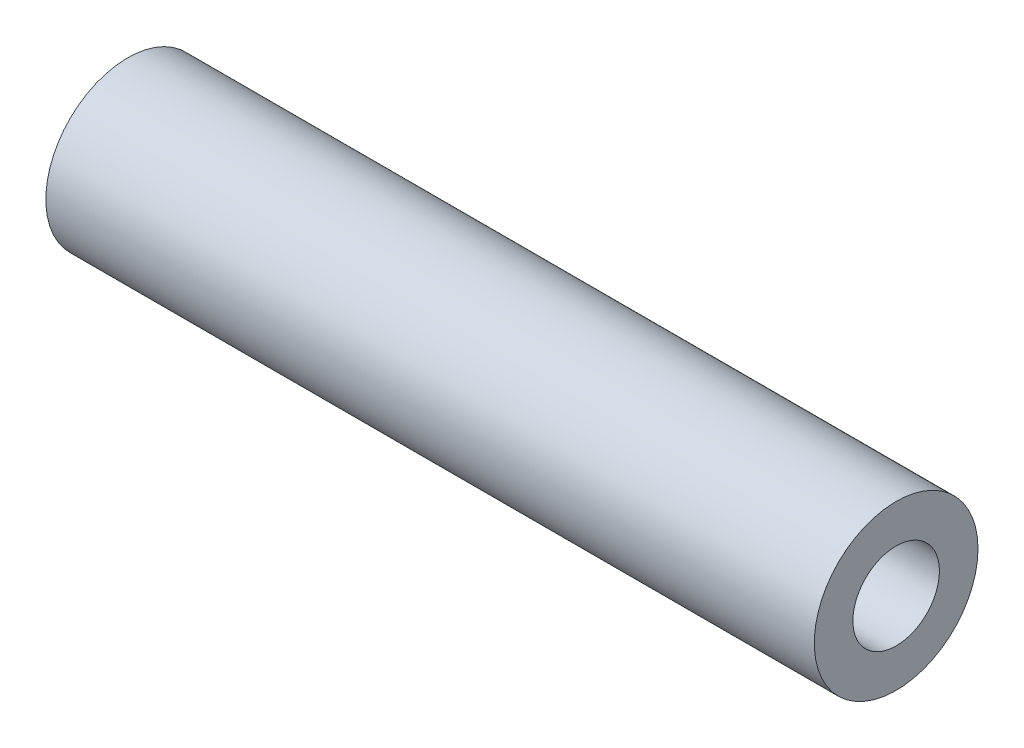
ISO-10303-21;
HEADER;
FILE_DESCRIPTION(('STEP AP214'),'2;1');
FILE_NAME('part.step','',(''),(''),'','','');
FILE_SCHEMA(('AUTOMOTIVE_DESIGN { 1 0 10303 214 1 1 1 1 }'));
ENDSEC;
DATA;
#1=APPLICATION_CONTEXT('core data for automotive mechanical design processes');
#2=APPLICATION_PROTOCOL_DEFINITION('international standard','automotive_design',2000,#1);
#3=PRODUCT_CONTEXT('',#1,'mechanical');
#4=PRODUCT('Part','Part','',(#3));
#5=PRODUCT_RELATED_PRODUCT_CATEGORY('part','',(#4));
#6=PRODUCT_DEFINITION_FORMATION('','',#4);
#7=PRODUCT_DEFINITION_CONTEXT('part definition',#1,'design');
#8=PRODUCT_DEFINITION('design','',#6,#7);
#9=PRODUCT_DEFINITION_SHAPE('','',#8);
#10=(LENGTH_UNIT() NAMED_UNIT(*) SI_UNIT(.MILLI.,.METRE.));
#11=(NAMED_UNIT(*) PLANE_ANGLE_UNIT() SI_UNIT($,.RADIAN.));
#12=(NAMED_UNIT(*) SI_UNIT($,.STERADIAN.) SOLID_ANGLE_UNIT());
#13=UNCERTAINTY_MEASURE_WITH_UNIT(LENGTH_MEASURE(1.E-05),#10,'distance_accuracy_value','');
#14=(GEOMETRIC_REPRESENTATION_CONTEXT(3) GLOBAL_UNCERTAINTY_ASSIGNED_CONTEXT((#13)) GLOBAL_UNIT_ASSIGNED_CONTEXT((#10,
#11,#12)) REPRESENTATION_CONTEXT('',''));
#15=CARTESIAN_POINT('',(0.,0.,0.));
#16=DIRECTION('',(0.,0.,1.));
#17=DIRECTION('',(1.,0.,0.));
#18=AXIS2_PLACEMENT_3D('',#15,#16,#17);
#19=CARTESIAN_POINT('',(28.9687,0.,0.));
#20=DIRECTION('',(1.,0.,0.));
#21=DIRECTION('',(0.,0.,-1.));
#22=AXIS2_PLACEMENT_3D('',#19,#20,#21);
#23=PLANE('',#22);
#24=CARTESIAN_POINT('',(28.9687,0.,0.));
#25=DIRECTION('',(1.,0.,0.));
#26=DIRECTION('',(0.,0.,-1.));
#27=AXIS2_PLACEMENT_3D('',#24,#25,#26);
#28=CIRCLE('',#27,3.0861);
#29=CARTESIAN_POINT('',(28.9687,0.,-3.0861));
#30=VERTEX_POINT('',#29);
#31=EDGE_CURVE('E10',#30,#30,#28,.T.);
#32=ORIENTED_EDGE('',*,*,#31,.T.);
#33=EDGE_LOOP('',(#32));
#34=FACE_BOUND('',#33,.T.);
#35=CARTESIAN_POINT('',(28.9687,0.,0.));
#36=DIRECTION('',(1.,0.,0.));
#37=DIRECTION('',(0.,0.,-1.));
#38=AXIS2_PLACEMENT_3D('',#35,#36,#37);
#39=CIRCLE('',#38,1.63195);
#40=CARTESIAN_POINT('',(28.9687,0.,-1.63195));
#41=VERTEX_POINT('',#40);
#42=EDGE_CURVE('E48',#41,#41,#39,.T.);
#43=ORIENTED_EDGE('',*,*,#42,.F.);
#44=EDGE_LOOP('',(#43));
#45=FACE_BOUND('',#44,.T.);
#46=ADVANCED_FACE('F37',(#34,#45),#23,.T.);
#47=CARTESIAN_POINT('',(0.,0.,0.));
#48=DIRECTION('',(1.,0.,0.));
#49=DIRECTION('',(0.,0.,-1.));
#50=AXIS2_PLACEMENT_3D('',#47,#48,#49);
#51=PLANE('',#50);
#52=CARTESIAN_POINT('',(0.,0.,0.));
#53=DIRECTION('',(1.,0.,0.));
#54=DIRECTION('',(0.,0.,-1.));
#55=AXIS2_PLACEMENT_3D('',#52,#53,#54);
#56=CIRCLE('',#55,3.0861);
#57=CARTESIAN_POINT('',(0.,0.,-3.0861));
#58=VERTEX_POINT('',#57);
#59=EDGE_CURVE('E41',#58,#58,#56,.T.);
#60=ORIENTED_EDGE('',*,*,#59,.F.);
#61=EDGE_LOOP('',(#60));
#62=FACE_BOUND('',#61,.T.);
#63=CARTESIAN_POINT('',(0.,0.,0.));
#64=DIRECTION('',(1.,0.,0.));
#65=DIRECTION('',(0.,0.,-1.));
#66=AXIS2_PLACEMENT_3D('',#63,#64,#65);
#67=CIRCLE('',#66,1.63195);
#68=CARTESIAN_POINT('',(0.,0.,-1.63195));
#69=VERTEX_POINT('',#68);
#70=EDGE_CURVE('E50',#69,#69,#67,.T.);
#71=ORIENTED_EDGE('',*,*,#70,.T.);
#72=EDGE_LOOP('',(#71));
#73=FACE_BOUND('',#72,.T.);
#74=ADVANCED_FACE('F60',(#62,#73),#51,.F.);
#75=CARTESIAN_POINT('',(28.9687,0.,0.));
#76=DIRECTION('',(-1.,0.,0.));
#77=DIRECTION('',(0.,0.,1.));
#78=AXIS2_PLACEMENT_3D('',#75,#76,#77);
#79=CYLINDRICAL_SURFACE('',#78,3.0861);
#80=ORIENTED_EDGE('',*,*,#31,.F.);
#81=EDGE_LOOP('',(#80));
#82=FACE_BOUND('',#81,.T.);
#83=ORIENTED_EDGE('',*,*,#59,.T.);
#84=EDGE_LOOP('',(#83));
#85=FACE_BOUND('',#84,.T.);
#86=ADVANCED_FACE('F39',(#82,#85),#79,.T.);
#87=CARTESIAN_POINT('',(28.9687,0.,0.));
#88=DIRECTION('',(-1.,0.,0.));
#89=DIRECTION('',(0.,0.,1.));
#90=AXIS2_PLACEMENT_3D('',#87,#88,#89);
#91=CYLINDRICAL_SURFACE('',#90,1.63195);
#92=ORIENTED_EDGE('',*,*,#42,.T.);
#93=EDGE_LOOP('',(#92));
#94=FACE_BOUND('',#93,.T.);
#95=ORIENTED_EDGE('',*,*,#70,.F.);
#96=EDGE_LOOP('',(#95));
#97=FACE_BOUND('',#96,.T.);
#98=ADVANCED_FACE('F56',(#94,#97),#91,.F.);
#99=CLOSED_SHELL('',(#46,#74,#86,#98));
#100=MANIFOLD_SOLID_BREP('B2',#99);
#101=ADVANCED_BREP_SHAPE_REPRESENTATION('',(#18,#100),#14);
#102=SHAPE_DEFINITION_REPRESENTATION(#9,#101);
ENDSEC;
END-ISO-10303-21;
